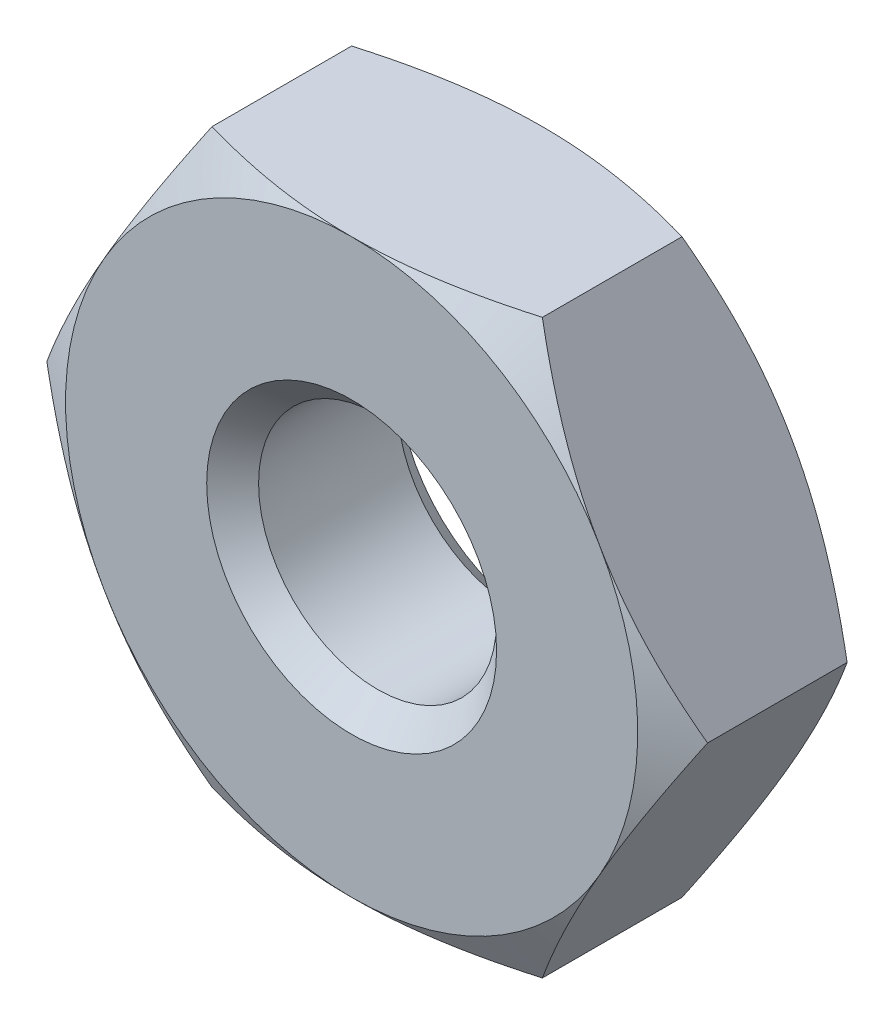
ISO-10303-21;
HEADER;
FILE_DESCRIPTION(('STEP AP214'),'2;1');
FILE_NAME('part.step','',(''),(''),'','','');
FILE_SCHEMA(('AUTOMOTIVE_DESIGN { 1 0 10303 214 1 1 1 1 }'));
ENDSEC;
DATA;
#1=APPLICATION_CONTEXT('core data for automotive mechanical design processes');
#2=APPLICATION_PROTOCOL_DEFINITION('international standard','automotive_design',2000,#1);
#3=PRODUCT_CONTEXT('',#1,'mechanical');
#4=PRODUCT('Part','Part','',(#3));
#5=PRODUCT_RELATED_PRODUCT_CATEGORY('part','',(#4));
#6=PRODUCT_DEFINITION_FORMATION('','',#4);
#7=PRODUCT_DEFINITION_CONTEXT('part definition',#1,'design');
#8=PRODUCT_DEFINITION('design','',#6,#7);
#9=PRODUCT_DEFINITION_SHAPE('','',#8);
#10=(LENGTH_UNIT() NAMED_UNIT(*) SI_UNIT(.MILLI.,.METRE.));
#11=(NAMED_UNIT(*) PLANE_ANGLE_UNIT() SI_UNIT($,.RADIAN.));
#12=(NAMED_UNIT(*) SI_UNIT($,.STERADIAN.) SOLID_ANGLE_UNIT());
#13=UNCERTAINTY_MEASURE_WITH_UNIT(LENGTH_MEASURE(1.E-05),#10,'distance_accuracy_value','');
#14=(GEOMETRIC_REPRESENTATION_CONTEXT(3) GLOBAL_UNCERTAINTY_ASSIGNED_CONTEXT((#13)) GLOBAL_UNIT_ASSIGNED_CONTEXT((#10,
#11,#12)) REPRESENTATION_CONTEXT('',''));
#15=CARTESIAN_POINT('',(0.,0.,0.));
#16=DIRECTION('',(0.,0.,1.));
#17=DIRECTION('',(1.,0.,0.));
#18=AXIS2_PLACEMENT_3D('',#15,#16,#17);
#19=CARTESIAN_POINT('',(0.,4.7625,1.5875));
#20=DIRECTION('',(0.,1.,0.));
#21=DIRECTION('',(0.,0.,1.));
#22=AXIS2_PLACEMENT_3D('',#19,#20,#21);
#23=PLANE('',#22);
#24=CARTESIAN_POINT('',(-7.29242571304484,4.7625,0.691483434039637));
#25=CARTESIAN_POINT('',(-7.08332503258644,4.7625,0.590434434608918));
#26=CARTESIAN_POINT('',(-6.87372996761939,4.7625,0.49038994627171));
#27=CARTESIAN_POINT('',(-6.45328375890254,4.7625,0.292884003041867));
#28=CARTESIAN_POINT('',(-6.24243240531598,4.7625,0.195422995372747));
#29=CARTESIAN_POINT('',(-5.818067307616,4.7625,0.00314459480451547));
#30=CARTESIAN_POINT('',(-5.60454523269943,4.7625,-0.0916544780914601));
#31=CARTESIAN_POINT('',(-5.17574610716181,4.7625,-0.277180770770624));
#32=CARTESIAN_POINT('',(-4.96046914871243,4.7625,-0.367908202800816));
#33=CARTESIAN_POINT('',(-4.5251454275538,4.7625,-0.54528563549685));
#34=CARTESIAN_POINT('',(-4.30507255346546,4.7625,-0.631871903322864));
#35=CARTESIAN_POINT('',(-3.86233085885286,4.7625,-0.79826297392008));
#36=CARTESIAN_POINT('',(-3.6396617526365,4.7625,-0.87806702220485));
#37=CARTESIAN_POINT('',(-3.19183146915336,4.7625,-1.02874956266948));
#38=CARTESIAN_POINT('',(-2.96667674136296,4.7625,-1.09964703053589));
#39=CARTESIAN_POINT('',(-2.51316408606383,4.7625,-1.23021306484863));
#40=CARTESIAN_POINT('',(-2.28480719615868,4.7625,-1.28988518227389));
#41=CARTESIAN_POINT('',(-1.82474524250015,4.7625,-1.39510666427489));
#42=CARTESIAN_POINT('',(-1.59303930440612,4.7625,-1.44065226848496));
#43=CARTESIAN_POINT('',(-1.12680140245445,4.7625,-1.51454273327568));
#44=CARTESIAN_POINT('',(-0.892269436098448,4.7625,-1.5428875786487));
#45=CARTESIAN_POINT('',(-0.54009824342306,4.7625,-1.57068723017757));
#46=CARTESIAN_POINT('',(-0.423010288487476,4.7625,-1.57750225520439));
#47=CARTESIAN_POINT('',(-0.188645495023605,4.7625,-1.58617083260467));
#48=CARTESIAN_POINT('',(-0.0713686589679974,4.7625,-1.58802444940905));
#49=CARTESIAN_POINT('',(0.163123105354889,4.7625,-1.58672040467325));
#50=CARTESIAN_POINT('',(0.280338041752277,4.7625,-1.58356415799784));
#51=CARTESIAN_POINT('',(0.514533140154534,4.7625,-1.57232042625916));
#52=CARTESIAN_POINT('',(0.631513289308026,4.7625,-1.56423267827197));
#53=CARTESIAN_POINT('',(0.915050030184753,4.7625,-1.53882110809835));
#54=CARTESIAN_POINT('',(1.08138937418057,4.7625,-1.5190254688449));
#55=CARTESIAN_POINT('',(1.41276151801412,4.7625,-1.47056600239034));
#56=CARTESIAN_POINT('',(1.57779414061617,4.7625,-1.44190099263948));
#57=CARTESIAN_POINT('',(2.07083902042289,4.7625,-1.34411689937243));
#58=CARTESIAN_POINT('',(2.39654516294855,4.7625,-1.26323434554015));
#59=CARTESIAN_POINT('',(2.88391142522152,4.7625,-1.12373221869611));
#60=CARTESIAN_POINT('',(3.04811363656015,4.7625,-1.07349062409159));
#61=CARTESIAN_POINT('',(3.37480455011008,4.7625,-0.968036135629946));
#62=CARTESIAN_POINT('',(3.53729434901437,4.7625,-0.912826670643465));
#63=CARTESIAN_POINT('',(3.85988055284395,4.7625,-0.798585099627141));
#64=CARTESIAN_POINT('',(4.0199852814054,4.7625,-0.739576259132611));
#65=CARTESIAN_POINT('',(4.33895253974561,4.7625,-0.618095079907987));
#66=CARTESIAN_POINT('',(4.49781453744472,4.7625,-0.555621341349745));
#67=CARTESIAN_POINT('',(4.65610216606022,4.7625,-0.491757089086173));
#68=B_SPLINE_CURVE_WITH_KNOTS('',3,(#24,#25,#26,#27,#28,#29,#30,#31,#32,#33,#34,#35,#36,#37,#38,
#39,#40,#41,#42,#43,#44,#45,#46,#47,#48,#49,#50,#51,#52,#53,#54,#55,#56,#57,#58,#59,#60,#61,#62,
#63,#64,#65,#66,#67),.UNSPECIFIED.,.F.,.F.,(4,2,2,2,2,2,2,2,2,2,2,2,2,2,2,2,2,2,2,2,2,4),(0.,
0.696720165483737,1.39356016205726,2.09438789250382,2.79517904757872,3.50457374312629,
4.21404725210227,4.92198260780581,5.62969364031721,6.33759289852653,7.04549278260687,
7.39726182154396,7.74902629223847,8.10069143675107,8.45237533199633,8.95462912158065,
9.45694990534678,10.4623513294482,10.9774608355396,11.4922174961111,12.0040767603637,
12.5161443452106),.UNSPECIFIED.);
#69=CARTESIAN_POINT('',(-2.7496306570156,4.7625,-1.16213065701559));
#70=VERTEX_POINT('',#69);
#71=CARTESIAN_POINT('',(0.,4.7625,-1.5875));
#72=VERTEX_POINT('',#71);
#73=EDGE_CURVE('E482',#70,#72,#68,.T.);
#74=ORIENTED_EDGE('',*,*,#73,.F.);
#75=DIRECTION('',(0.,0.,-1.));
#76=VECTOR('',#75,1.);
#77=CARTESIAN_POINT('',(-2.7496306570156,4.7625,1.5875));
#78=LINE('',#77,#76);
#79=CARTESIAN_POINT('',(-2.7496306570156,4.7625,1.16213065701559));
#80=VERTEX_POINT('',#79);
#81=EDGE_CURVE('E156',#80,#70,#78,.T.);
#82=ORIENTED_EDGE('',*,*,#81,.F.);
#83=CARTESIAN_POINT('',(-7.29242571304484,4.7625,-0.69148343403963));
#84=CARTESIAN_POINT('',(-7.08332503258644,4.7625,-0.590434434608913));
#85=CARTESIAN_POINT('',(-6.87372996761939,4.7625,-0.490389946271707));
#86=CARTESIAN_POINT('',(-6.45328375890254,4.7625,-0.292884003041865));
#87=CARTESIAN_POINT('',(-6.24243240531598,4.7625,-0.195422995372745));
#88=CARTESIAN_POINT('',(-5.818067307616,4.7625,-0.00314459480451323));
#89=CARTESIAN_POINT('',(-5.60454523269943,4.7625,0.0916544780914618));
#90=CARTESIAN_POINT('',(-5.17574610716181,4.7625,0.277180770770625));
#91=CARTESIAN_POINT('',(-4.96046914871243,4.7625,0.367908202800817));
#92=CARTESIAN_POINT('',(-4.5251454275538,4.7625,0.54528563549685));
#93=CARTESIAN_POINT('',(-4.30507255346547,4.7625,0.631871903322865));
#94=CARTESIAN_POINT('',(-3.86233085885286,4.7625,0.79826297392008));
#95=CARTESIAN_POINT('',(-3.6396617526365,4.7625,0.87806702220485));
#96=CARTESIAN_POINT('',(-3.19183146915336,4.7625,1.02874956266948));
#97=CARTESIAN_POINT('',(-2.96667674136296,4.7625,1.09964703053589));
#98=CARTESIAN_POINT('',(-2.51316408606383,4.7625,1.23021306484863));
#99=CARTESIAN_POINT('',(-2.28480719615868,4.7625,1.28988518227389));
#100=CARTESIAN_POINT('',(-1.82474524250015,4.7625,1.39510666427489));
#101=CARTESIAN_POINT('',(-1.59303930440612,4.7625,1.44065226848496));
#102=CARTESIAN_POINT('',(-1.12680140245445,4.7625,1.51454273327568));
#103=CARTESIAN_POINT('',(-0.892269436098448,4.7625,1.5428875786487));
#104=CARTESIAN_POINT('',(-0.54009824342306,4.7625,1.57068723017757));
#105=CARTESIAN_POINT('',(-0.423010288487477,4.7625,1.57750225520439));
#106=CARTESIAN_POINT('',(-0.188645495023606,4.7625,1.58617083260467));
#107=CARTESIAN_POINT('',(-0.0713686589679986,4.7625,1.58802444940905));
#108=CARTESIAN_POINT('',(0.163123105354887,4.7625,1.58672040467325));
#109=CARTESIAN_POINT('',(0.280338041752275,4.7625,1.58356415799784));
#110=CARTESIAN_POINT('',(0.514533140154532,4.7625,1.57232042625916));
#111=CARTESIAN_POINT('',(0.631513289308023,4.7625,1.56423267827197));
#112=CARTESIAN_POINT('',(0.915050030184751,4.7625,1.53882110809835));
#113=CARTESIAN_POINT('',(1.08138937418057,4.7625,1.5190254688449));
#114=CARTESIAN_POINT('',(1.41276151801412,4.7625,1.47056600239034));
#115=CARTESIAN_POINT('',(1.57779414061617,4.7625,1.44190099263948));
#116=CARTESIAN_POINT('',(2.07083902042289,4.7625,1.34411689937243));
#117=CARTESIAN_POINT('',(2.39654516294855,4.7625,1.26323434554015));
#118=CARTESIAN_POINT('',(2.88391142522152,4.7625,1.12373221869611));
#119=CARTESIAN_POINT('',(3.04811363656016,4.7625,1.07349062409159));
#120=CARTESIAN_POINT('',(3.37480455011009,4.7625,0.968036135629945));
#121=CARTESIAN_POINT('',(3.53729434901437,4.7625,0.912826670643465));
#122=CARTESIAN_POINT('',(3.85988055284396,4.7625,0.79858509962714));
#123=CARTESIAN_POINT('',(4.0199852814054,4.7625,0.739576259132609));
#124=CARTESIAN_POINT('',(4.33895253974562,4.7625,0.618095079907985));
#125=CARTESIAN_POINT('',(4.49781453744473,4.7625,0.555621341349743));
#126=CARTESIAN_POINT('',(4.65610216606023,4.7625,0.491757089086171));
#127=B_SPLINE_CURVE_WITH_KNOTS('',3,(#83,#84,#85,#86,#87,#88,#89,#90,#91,#92,#93,#94,#95,#96,
#97,#98,#99,#100,#101,#102,#103,#104,#105,#106,#107,#108,#109,#110,#111,#112,#113,#114,#115,
#116,#117,#118,#119,#120,#121,#122,#123,#124,#125,#126),.UNSPECIFIED.,.F.,.F.,(4,2,2,2,2,2,2,2,
2,2,2,2,2,2,2,2,2,2,2,2,2,4),(0.,0.696720165483736,1.39356016205726,2.09438789250381,
2.79517904757872,3.50457374312629,4.21404725210227,4.92198260780581,5.6296936403172,
6.33759289852653,7.04549278260686,7.39726182154395,7.74902629223847,8.10069143675107,
8.45237533199633,8.95462912158064,9.45694990534677,10.4623513294482,10.9774608355396,
11.4922174961111,12.0040767603637,12.5161443452106),.UNSPECIFIED.);
#128=CARTESIAN_POINT('',(0.,4.7625,1.5875));
#129=VERTEX_POINT('',#128);
#130=EDGE_CURVE('E308',#80,#129,#127,.T.);
#131=ORIENTED_EDGE('',*,*,#130,.T.);
#132=CARTESIAN_POINT('',(2.74963065701559,4.7625,1.16213065701559));
#133=VERTEX_POINT('',#132);
#134=EDGE_CURVE('E210',#129,#133,#127,.T.);
#135=ORIENTED_EDGE('',*,*,#134,.T.);
#136=DIRECTION('',(0.,0.,-1.));
#137=VECTOR('',#136,1.);
#138=CARTESIAN_POINT('',(2.74963065701559,4.7625,1.5875));
#139=LINE('',#138,#137);
#140=CARTESIAN_POINT('',(2.74963065701559,4.7625,-1.16213065701559));
#141=VERTEX_POINT('',#140);
#142=EDGE_CURVE('E136',#133,#141,#139,.T.);
#143=ORIENTED_EDGE('',*,*,#142,.T.);
#144=EDGE_CURVE('E128',#72,#141,#68,.T.);
#145=ORIENTED_EDGE('',*,*,#144,.F.);
#146=EDGE_LOOP('',(#74,#82,#131,#135,#143,#145));
#147=FACE_BOUND('',#146,.T.);
#148=ADVANCED_FACE('F17',(#147),#23,.T.);
#149=CARTESIAN_POINT('',(-4.12444598552339,2.38125,1.5875));
#150=DIRECTION('',(-0.866025403784439,0.5,0.));
#151=DIRECTION('',(-0.5,-0.866025403784439,0.));
#152=AXIS2_PLACEMENT_3D('',#149,#150,#151);
#153=PLANE('',#152);
#154=CARTESIAN_POINT('',(-5.49937678408503,-0.000200000000000149,-1.16206398824923));
#155=CARTESIAN_POINT('',(-5.37853889601658,0.209097361613877,-1.23184638758605));
#156=CARTESIAN_POINT('',(-5.25666747870888,0.420184848381227,-1.29531673538477));
#157=CARTESIAN_POINT('',(-5.01081433128269,0.846014990924112,-1.40610480393128));
#158=CARTESIAN_POINT('',(-4.88682823299882,1.060765212584,-1.4533833345702));
#159=CARTESIAN_POINT('',(-4.64037371706653,1.48763695593353,-1.52696647463121));
#160=CARTESIAN_POINT('',(-4.51794368116041,1.69969199849541,-1.55376120779827));
#161=CARTESIAN_POINT('',(-4.33386795649885,2.0185205060493,-1.57778887781912));
#162=CARTESIAN_POINT('',(-4.27246738882597,2.12486940887228,-1.58310535899069));
#163=CARTESIAN_POINT('',(-4.1496095068933,2.33766550248998,-1.58825983656829));
#164=CARTESIAN_POINT('',(-4.08815219444489,2.44411269014726,-1.58809800219079));
#165=CARTESIAN_POINT('',(-3.91977561066751,2.73574948805456,-1.58011505017809));
#166=CARTESIAN_POINT('',(-3.81291212955969,2.92084246680697,-1.56670757951211));
#167=CARTESIAN_POINT('',(-3.59989441060936,3.28979997894137,-1.52419213715631));
#168=CARTESIAN_POINT('',(-3.49374092153974,3.47366321541067,-1.4950696317199));
#169=CARTESIAN_POINT('',(-3.28029401006835,3.84336411079777,-1.4222707464131));
#170=CARTESIAN_POINT('',(-3.17302752682367,4.02915510972679,-1.37828588695335));
#171=CARTESIAN_POINT('',(-2.96009430473234,4.39796626900832,-1.27845772006117));
#172=CARTESIAN_POINT('',(-2.85442483842812,4.58099115345591,-1.22263786532194));
#173=CARTESIAN_POINT('',(-2.74951518696175,4.7627,-1.16206398824923));
#174=B_SPLINE_CURVE_WITH_KNOTS('',3,(#154,#155,#156,#157,#158,#159,#160,#161,#162,#163,#164,
#165,#166,#167,#168,#169,#170,#171,#172,#173),.UNSPECIFIED.,.F.,.F.,(4,2,2,2,2,2,2,2,2,4),(0.,
0.754910190012918,1.51163483480638,2.24963134670895,2.61827336240839,2.9869039913527,
3.6286742319225,4.27103902109237,4.92765153591997,5.58297484368455),.UNSPECIFIED.);
#175=CARTESIAN_POINT('',(-5.49926131403119,0.,-1.16213065701559));
#176=VERTEX_POINT('',#175);
#177=CARTESIAN_POINT('',(-4.12444598552339,2.38125,-1.5875));
#178=VERTEX_POINT('',#177);
#179=EDGE_CURVE('E255',#176,#178,#174,.T.);
#180=ORIENTED_EDGE('',*,*,#179,.F.);
#181=DIRECTION('',(0.,0.,-1.));
#182=VECTOR('',#181,1.);
#183=CARTESIAN_POINT('',(-5.49926131403119,0.,1.5875));
#184=LINE('',#183,#182);
#185=CARTESIAN_POINT('',(-5.49926131403119,0.,1.16213065701559));
#186=VERTEX_POINT('',#185);
#187=EDGE_CURVE('E152',#186,#176,#184,.T.);
#188=ORIENTED_EDGE('',*,*,#187,.F.);
#189=CARTESIAN_POINT('',(-5.49937678408503,-0.000200000000000149,1.16206398824923));
#190=CARTESIAN_POINT('',(-5.37853889601658,0.209097361613877,1.23184638758605));
#191=CARTESIAN_POINT('',(-5.25666747870888,0.420184848381226,1.29531673538478));
#192=CARTESIAN_POINT('',(-5.01081433128269,0.846014990924112,1.40610480393128));
#193=CARTESIAN_POINT('',(-4.88682823299882,1.060765212584,1.4533833345702));
#194=CARTESIAN_POINT('',(-4.64037371706653,1.48763695593353,1.52696647463121));
#195=CARTESIAN_POINT('',(-4.51794368116041,1.69969199849541,1.55376120779827));
#196=CARTESIAN_POINT('',(-4.33386795649885,2.0185205060493,1.57778887781912));
#197=CARTESIAN_POINT('',(-4.27246738882597,2.12486940887228,1.58310535899069));
#198=CARTESIAN_POINT('',(-4.1496095068933,2.33766550248998,1.58825983656829));
#199=CARTESIAN_POINT('',(-4.08815219444489,2.44411269014726,1.58809800219079));
#200=CARTESIAN_POINT('',(-3.91977561066751,2.73574948805456,1.58011505017809));
#201=CARTESIAN_POINT('',(-3.81291212955969,2.92084246680697,1.56670757951211));
#202=CARTESIAN_POINT('',(-3.59989441060936,3.28979997894137,1.52419213715631));
#203=CARTESIAN_POINT('',(-3.49374092153974,3.47366321541067,1.4950696317199));
#204=CARTESIAN_POINT('',(-3.28029401006835,3.84336411079777,1.4222707464131));
#205=CARTESIAN_POINT('',(-3.17302752682367,4.02915510972679,1.37828588695335));
#206=CARTESIAN_POINT('',(-2.96009430473234,4.39796626900832,1.27845772006117));
#207=CARTESIAN_POINT('',(-2.85442483842812,4.58099115345591,1.22263786532194));
#208=CARTESIAN_POINT('',(-2.74951518696175,4.7627,1.16206398824923));
#209=B_SPLINE_CURVE_WITH_KNOTS('',3,(#189,#190,#191,#192,#193,#194,#195,#196,#197,#198,#199,
#200,#201,#202,#203,#204,#205,#206,#207,#208),.UNSPECIFIED.,.F.,.F.,(4,2,2,2,2,2,2,2,2,4),(0.,
0.754910190012918,1.51163483480638,2.24963134670895,2.61827336240839,2.9869039913527,
3.6286742319225,4.27103902109237,4.92765153591997,5.58297484368455),.UNSPECIFIED.);
#210=CARTESIAN_POINT('',(-4.12444598552339,2.38125,1.5875));
#211=VERTEX_POINT('',#210);
#212=EDGE_CURVE('E232',#186,#211,#209,.T.);
#213=ORIENTED_EDGE('',*,*,#212,.T.);
#214=EDGE_CURVE('E224',#211,#80,#209,.T.);
#215=ORIENTED_EDGE('',*,*,#214,.T.);
#216=ORIENTED_EDGE('',*,*,#81,.T.);
#217=EDGE_CURVE('E248',#178,#70,#174,.T.);
#218=ORIENTED_EDGE('',*,*,#217,.F.);
#219=EDGE_LOOP('',(#180,#188,#213,#215,#216,#218));
#220=FACE_BOUND('',#219,.T.);
#221=ADVANCED_FACE('F239',(#220),#153,.T.);
#222=CARTESIAN_POINT('',(-4.12444598552339,-2.38125,1.5875));
#223=DIRECTION('',(-0.866025403784438,-0.5,0.));
#224=DIRECTION('',(0.5,-0.866025403784438,0.));
#225=AXIS2_PLACEMENT_3D('',#222,#223,#224);
#226=PLANE('',#225);
#227=CARTESIAN_POINT('',(-2.74951518696175,-4.7627,-1.16206398824923));
#228=CARTESIAN_POINT('',(-2.8703530750302,-4.55340263838612,-1.23184638758605));
#229=CARTESIAN_POINT('',(-2.9922244923379,-4.34231515161877,-1.29531673538478));
#230=CARTESIAN_POINT('',(-3.23807763976409,-3.91648500907589,-1.40610480393128));
#231=CARTESIAN_POINT('',(-3.36206373804796,-3.701734787416,-1.4533833345702));
#232=CARTESIAN_POINT('',(-3.60851825398025,-3.27486304406647,-1.52696647463121));
#233=CARTESIAN_POINT('',(-3.73094828988637,-3.06280800150459,-1.55376120779827));
#234=CARTESIAN_POINT('',(-3.91502401454793,-2.7439794939507,-1.57778887781912));
#235=CARTESIAN_POINT('',(-3.97642458222081,-2.63763059112772,-1.58310535899069));
#236=CARTESIAN_POINT('',(-4.09928246415348,-2.42483449751002,-1.58825983656829));
#237=CARTESIAN_POINT('',(-4.1607397766019,-2.31838730985274,-1.58809800219079));
#238=CARTESIAN_POINT('',(-4.32911636037927,-2.02675051194544,-1.58011505017809));
#239=CARTESIAN_POINT('',(-4.43597984148709,-1.84165753319303,-1.56670757951211));
#240=CARTESIAN_POINT('',(-4.64899756043742,-1.47270002105863,-1.52419213715631));
#241=CARTESIAN_POINT('',(-4.75515104950704,-1.28883678458933,-1.4950696317199));
#242=CARTESIAN_POINT('',(-4.96859796097843,-0.919135889202231,-1.4222707464131));
#243=CARTESIAN_POINT('',(-5.07586444422311,-0.733344890273211,-1.37828588695334));
#244=CARTESIAN_POINT('',(-5.28879766631444,-0.364533730991676,-1.27845772006117));
#245=CARTESIAN_POINT('',(-5.39446713261866,-0.18150884654409,-1.22263786532194));
#246=CARTESIAN_POINT('',(-5.49937678408503,0.000199999999999961,-1.16206398824923));
#247=B_SPLINE_CURVE_WITH_KNOTS('',3,(#227,#228,#229,#230,#231,#232,#233,#234,#235,#236,#237,
#238,#239,#240,#241,#242,#243,#244,#245,#246),.UNSPECIFIED.,.F.,.F.,(4,2,2,2,2,2,2,2,2,4),(0.,
0.754910190012918,1.51163483480638,2.24963134670895,2.61827336240839,2.9869039913527,
3.6286742319225,4.27103902109237,4.92765153591997,5.58297484368456),.UNSPECIFIED.);
#248=CARTESIAN_POINT('',(-2.7496306570156,-4.7625,-1.16213065701559));
#249=VERTEX_POINT('',#248);
#250=CARTESIAN_POINT('',(-4.12444598552339,-2.38125,-1.5875));
#251=VERTEX_POINT('',#250);
#252=EDGE_CURVE('E268',#249,#251,#247,.T.);
#253=ORIENTED_EDGE('',*,*,#252,.F.);
#254=DIRECTION('',(0.,0.,-1.));
#255=VECTOR('',#254,1.);
#256=CARTESIAN_POINT('',(-2.74963065701559,-4.7625,1.5875));
#257=LINE('',#256,#255);
#258=CARTESIAN_POINT('',(-2.7496306570156,-4.7625,1.16213065701559));
#259=VERTEX_POINT('',#258);
#260=EDGE_CURVE('E141',#259,#249,#257,.T.);
#261=ORIENTED_EDGE('',*,*,#260,.F.);
#262=CARTESIAN_POINT('',(-2.74951518696175,-4.7627,1.16206398824923));
#263=CARTESIAN_POINT('',(-2.8703530750302,-4.55340263838612,1.23184638758605));
#264=CARTESIAN_POINT('',(-2.9922244923379,-4.34231515161877,1.29531673538478));
#265=CARTESIAN_POINT('',(-3.23807763976409,-3.91648500907589,1.40610480393128));
#266=CARTESIAN_POINT('',(-3.36206373804796,-3.701734787416,1.4533833345702));
#267=CARTESIAN_POINT('',(-3.60851825398025,-3.27486304406647,1.52696647463121));
#268=CARTESIAN_POINT('',(-3.73094828988637,-3.06280800150459,1.55376120779827));
#269=CARTESIAN_POINT('',(-3.91502401454793,-2.7439794939507,1.57778887781912));
#270=CARTESIAN_POINT('',(-3.97642458222081,-2.63763059112772,1.58310535899069));
#271=CARTESIAN_POINT('',(-4.09928246415348,-2.42483449751002,1.58825983656829));
#272=CARTESIAN_POINT('',(-4.1607397766019,-2.31838730985274,1.58809800219079));
#273=CARTESIAN_POINT('',(-4.32911636037927,-2.02675051194544,1.58011505017809));
#274=CARTESIAN_POINT('',(-4.43597984148709,-1.84165753319303,1.56670757951211));
#275=CARTESIAN_POINT('',(-4.64899756043742,-1.47270002105863,1.52419213715631));
#276=CARTESIAN_POINT('',(-4.75515104950704,-1.28883678458933,1.4950696317199));
#277=CARTESIAN_POINT('',(-4.96859796097843,-0.919135889202232,1.4222707464131));
#278=CARTESIAN_POINT('',(-5.07586444422311,-0.733344890273212,1.37828588695335));
#279=CARTESIAN_POINT('',(-5.28879766631444,-0.364533730991678,1.27845772006117));
#280=CARTESIAN_POINT('',(-5.39446713261866,-0.181508846544092,1.22263786532194));
#281=CARTESIAN_POINT('',(-5.49937678408503,0.000199999999998806,1.16206398824923));
#282=B_SPLINE_CURVE_WITH_KNOTS('',3,(#262,#263,#264,#265,#266,#267,#268,#269,#270,#271,#272,
#273,#274,#275,#276,#277,#278,#279,#280,#281),.UNSPECIFIED.,.F.,.F.,(4,2,2,2,2,2,2,2,2,4),(0.,
0.754910190012917,1.51163483480638,2.24963134670895,2.61827336240839,2.9869039913527,
3.6286742319225,4.27103902109237,4.92765153591997,5.58297484368455),.UNSPECIFIED.);
#283=CARTESIAN_POINT('',(-4.12444598552339,-2.38125,1.5875));
#284=VERTEX_POINT('',#283);
#285=EDGE_CURVE('E145',#259,#284,#282,.T.);
#286=ORIENTED_EDGE('',*,*,#285,.T.);
#287=EDGE_CURVE('E233',#284,#186,#282,.T.);
#288=ORIENTED_EDGE('',*,*,#287,.T.);
#289=ORIENTED_EDGE('',*,*,#187,.T.);
#290=EDGE_CURVE('E262',#251,#176,#247,.T.);
#291=ORIENTED_EDGE('',*,*,#290,.F.);
#292=EDGE_LOOP('',(#253,#261,#286,#288,#289,#291));
#293=FACE_BOUND('',#292,.T.);
#294=ADVANCED_FACE('F242',(#293),#226,.T.);
#295=CARTESIAN_POINT('',(0.,-4.7625,1.5875));
#296=DIRECTION('',(0.,-1.,0.));
#297=DIRECTION('',(0.,0.,-1.));
#298=AXIS2_PLACEMENT_3D('',#295,#296,#297);
#299=PLANE('',#298);
#300=CARTESIAN_POINT('',(-7.29242571304483,-4.7625,0.691483434039635));
#301=CARTESIAN_POINT('',(-7.08332503258643,-4.7625,0.590434434608914));
#302=CARTESIAN_POINT('',(-6.87372996761938,-4.7625,0.490389946271706));
#303=CARTESIAN_POINT('',(-6.45328375890254,-4.7625,0.292884003041863));
#304=CARTESIAN_POINT('',(-6.24243240531597,-4.7625,0.195422995372744));
#305=CARTESIAN_POINT('',(-5.81806730761599,-4.7625,0.00314459480451335));
#306=CARTESIAN_POINT('',(-5.60454523269943,-4.7625,-0.0916544780914621));
#307=CARTESIAN_POINT('',(-5.1757461071618,-4.7625,-0.277180770770626));
#308=CARTESIAN_POINT('',(-4.96046914871242,-4.7625,-0.367908202800818));
#309=CARTESIAN_POINT('',(-4.5251454275538,-4.7625,-0.545285635496851));
#310=CARTESIAN_POINT('',(-4.30507255346546,-4.7625,-0.631871903322865));
#311=CARTESIAN_POINT('',(-3.86233085885286,-4.7625,-0.798262973920081));
#312=CARTESIAN_POINT('',(-3.6396617526365,-4.7625,-0.878067022204851));
#313=CARTESIAN_POINT('',(-3.19183146915336,-4.7625,-1.02874956266948));
#314=CARTESIAN_POINT('',(-2.96667674136295,-4.7625,-1.09964703053589));
#315=CARTESIAN_POINT('',(-2.51316408606383,-4.7625,-1.23021306484863));
#316=CARTESIAN_POINT('',(-2.28480719615868,-4.7625,-1.2898851822739));
#317=CARTESIAN_POINT('',(-1.82474524250015,-4.7625,-1.39510666427489));
#318=CARTESIAN_POINT('',(-1.59303930440612,-4.7625,-1.44065226848496));
#319=CARTESIAN_POINT('',(-1.12680140245445,-4.7625,-1.51454273327567));
#320=CARTESIAN_POINT('',(-0.892269436098447,-4.7625,-1.5428875786487));
#321=CARTESIAN_POINT('',(-0.540098243423059,-4.7625,-1.57068723017757));
#322=CARTESIAN_POINT('',(-0.423010288487475,-4.7625,-1.57750225520439));
#323=CARTESIAN_POINT('',(-0.188645495023604,-4.7625,-1.58617083260467));
#324=CARTESIAN_POINT('',(-0.0713686589679967,-4.7625,-1.58802444940905));
#325=CARTESIAN_POINT('',(0.16312310535489,-4.7625,-1.58672040467325));
#326=CARTESIAN_POINT('',(0.280338041752279,-4.7625,-1.58356415799784));
#327=CARTESIAN_POINT('',(0.514533140154536,-4.7625,-1.57232042625916));
#328=CARTESIAN_POINT('',(0.631513289308028,-4.7625,-1.56423267827197));
#329=CARTESIAN_POINT('',(0.915050030184756,-4.7625,-1.53882110809835));
#330=CARTESIAN_POINT('',(1.08138937418058,-4.7625,-1.51902546884489));
#331=CARTESIAN_POINT('',(1.41276151801412,-4.7625,-1.47056600239034));
#332=CARTESIAN_POINT('',(1.57779414061617,-4.7625,-1.44190099263948));
#333=CARTESIAN_POINT('',(2.07083902042289,-4.7625,-1.34411689937243));
#334=CARTESIAN_POINT('',(2.39654516294855,-4.7625,-1.26323434554015));
#335=CARTESIAN_POINT('',(2.88391142522152,-4.7625,-1.1237322186961));
#336=CARTESIAN_POINT('',(3.04811363656016,-4.7625,-1.07349062409159));
#337=CARTESIAN_POINT('',(3.37480455011009,-4.7625,-0.968036135629944));
#338=CARTESIAN_POINT('',(3.53729434901437,-4.7625,-0.912826670643465));
#339=CARTESIAN_POINT('',(3.85988055284395,-4.7625,-0.798585099627141));
#340=CARTESIAN_POINT('',(4.0199852814054,-4.7625,-0.73957625913261));
#341=CARTESIAN_POINT('',(4.33895253974562,-4.7625,-0.618095079907986));
#342=CARTESIAN_POINT('',(4.49781453744472,-4.7625,-0.555621341349744));
#343=CARTESIAN_POINT('',(4.65610216606022,-4.7625,-0.491757089086171));
#344=B_SPLINE_CURVE_WITH_KNOTS('',3,(#300,#301,#302,#303,#304,#305,#306,#307,#308,#309,#310,
#311,#312,#313,#314,#315,#316,#317,#318,#319,#320,#321,#322,#323,#324,#325,#326,#327,#328,#329,
#330,#331,#332,#333,#334,#335,#336,#337,#338,#339,#340,#341,#342,#343),.UNSPECIFIED.,.F.,.F.,(4,
2,2,2,2,2,2,2,2,2,2,2,2,2,2,2,2,2,2,2,2,4),(0.,0.696720165483734,1.39356016205725,
2.09438789250381,2.79517904757872,3.50457374312628,4.21404725210226,4.9219826078058,
5.6296936403172,6.33759289852652,7.04549278260686,7.39726182154395,7.74902629223846,
8.10069143675107,8.45237533199633,8.95462912158064,9.45694990534677,10.4623513294482,
10.9774608355396,11.4922174961111,12.0040767603637,12.5161443452105),.UNSPECIFIED.);
#345=CARTESIAN_POINT('',(2.74963065701559,-4.7625,-1.16213065701559));
#346=VERTEX_POINT('',#345);
#347=CARTESIAN_POINT('',(0.,-4.7625,-1.5875));
#348=VERTEX_POINT('',#347);
#349=EDGE_CURVE('E256',#346,#348,#344,.F.);
#350=ORIENTED_EDGE('',*,*,#349,.F.);
#351=DIRECTION('',(0.,0.,-1.));
#352=VECTOR('',#351,1.);
#353=CARTESIAN_POINT('',(2.7496306570156,-4.7625,1.5875));
#354=LINE('',#353,#352);
#355=CARTESIAN_POINT('',(2.74963065701559,-4.7625,1.16213065701559));
#356=VERTEX_POINT('',#355);
#357=EDGE_CURVE('E135',#356,#346,#354,.T.);
#358=ORIENTED_EDGE('',*,*,#357,.F.);
#359=CARTESIAN_POINT('',(-7.29242571304483,-4.7625,-0.691483434039629));
#360=CARTESIAN_POINT('',(-7.08332503258643,-4.7625,-0.59043443460891));
#361=CARTESIAN_POINT('',(-6.87372996761938,-4.7625,-0.490389946271703));
#362=CARTESIAN_POINT('',(-6.45328375890254,-4.7625,-0.292884003041861));
#363=CARTESIAN_POINT('',(-6.24243240531597,-4.7625,-0.195422995372742));
#364=CARTESIAN_POINT('',(-5.81806730761599,-4.7625,-0.00314459480451045));
#365=CARTESIAN_POINT('',(-5.60454523269943,-4.7625,0.0916544780914648));
#366=CARTESIAN_POINT('',(-5.1757461071618,-4.7625,0.277180770770628));
#367=CARTESIAN_POINT('',(-4.96046914871242,-4.7625,0.36790820280082));
#368=CARTESIAN_POINT('',(-4.5251454275538,-4.7625,0.545285635496852));
#369=CARTESIAN_POINT('',(-4.30507255346546,-4.7625,0.631871903322867));
#370=CARTESIAN_POINT('',(-3.86233085885285,-4.7625,0.798262973920082));
#371=CARTESIAN_POINT('',(-3.6396617526365,-4.7625,0.878067022204852));
#372=CARTESIAN_POINT('',(-3.19183146915336,-4.7625,1.02874956266948));
#373=CARTESIAN_POINT('',(-2.96667674136295,-4.7625,1.09964703053589));
#374=CARTESIAN_POINT('',(-2.51316408606383,-4.7625,1.23021306484864));
#375=CARTESIAN_POINT('',(-2.28480719615868,-4.7625,1.2898851822739));
#376=CARTESIAN_POINT('',(-1.82474524250015,-4.7625,1.39510666427489));
#377=CARTESIAN_POINT('',(-1.59303930440612,-4.7625,1.44065226848496));
#378=CARTESIAN_POINT('',(-1.12680140245445,-4.7625,1.51454273327567));
#379=CARTESIAN_POINT('',(-0.892269436098448,-4.7625,1.5428875786487));
#380=CARTESIAN_POINT('',(-0.540098243423059,-4.7625,1.57068723017757));
#381=CARTESIAN_POINT('',(-0.423010288487475,-4.7625,1.57750225520439));
#382=CARTESIAN_POINT('',(-0.188645495023604,-4.7625,1.58617083260467));
#383=CARTESIAN_POINT('',(-0.0713686589679967,-4.7625,1.58802444940905));
#384=CARTESIAN_POINT('',(0.16312310535489,-4.7625,1.58672040467325));
#385=CARTESIAN_POINT('',(0.280338041752278,-4.7625,1.58356415799784));
#386=CARTESIAN_POINT('',(0.514533140154535,-4.7625,1.57232042625916));
#387=CARTESIAN_POINT('',(0.631513289308026,-4.7625,1.56423267827197));
#388=CARTESIAN_POINT('',(0.915050030184755,-4.7625,1.53882110809835));
#389=CARTESIAN_POINT('',(1.08138937418058,-4.7625,1.51902546884489));
#390=CARTESIAN_POINT('',(1.41276151801413,-4.7625,1.47056600239034));
#391=CARTESIAN_POINT('',(1.57779414061617,-4.7625,1.44190099263948));
#392=CARTESIAN_POINT('',(2.0708390204229,-4.7625,1.34411689937243));
#393=CARTESIAN_POINT('',(2.39654516294856,-4.7625,1.26323434554015));
#394=CARTESIAN_POINT('',(2.88391142522153,-4.7625,1.1237322186961));
#395=CARTESIAN_POINT('',(3.04811363656017,-4.7625,1.07349062409159));
#396=CARTESIAN_POINT('',(3.3748045501101,-4.7625,0.968036135629942));
#397=CARTESIAN_POINT('',(3.53729434901438,-4.7625,0.912826670643461));
#398=CARTESIAN_POINT('',(3.85988055284397,-4.7625,0.798585099627136));
#399=CARTESIAN_POINT('',(4.01998528140541,-4.7625,0.739576259132605));
#400=CARTESIAN_POINT('',(4.33895253974563,-4.7625,0.618095079907981));
#401=CARTESIAN_POINT('',(4.49781453744474,-4.7625,0.55562134134974));
#402=CARTESIAN_POINT('',(4.65610216606024,-4.7625,0.491757089086169));
#403=B_SPLINE_CURVE_WITH_KNOTS('',3,(#359,#360,#361,#362,#363,#364,#365,#366,#367,#368,#369,
#370,#371,#372,#373,#374,#375,#376,#377,#378,#379,#380,#381,#382,#383,#384,#385,#386,#387,#388,
#389,#390,#391,#392,#393,#394,#395,#396,#397,#398,#399,#400,#401,#402),.UNSPECIFIED.,.F.,.F.,(4,
2,2,2,2,2,2,2,2,2,2,2,2,2,2,2,2,2,2,2,2,4),(0.,0.696720165483734,1.39356016205725,
2.09438789250381,2.79517904757872,3.50457374312628,4.21404725210226,4.9219826078058,
5.62969364031719,6.33759289852652,7.04549278260686,7.39726182154394,7.74902629223846,
8.10069143675106,8.45237533199632,8.95462912158064,9.45694990534677,10.4623513294482,
10.9774608355396,11.4922174961111,12.0040767603637,12.5161443452106),.UNSPECIFIED.);
#404=CARTESIAN_POINT('',(0.,-4.7625,1.5875));
#405=VERTEX_POINT('',#404);
#406=EDGE_CURVE('E217',#356,#405,#403,.F.);
#407=ORIENTED_EDGE('',*,*,#406,.T.);
#408=EDGE_CURVE('E313',#405,#259,#403,.F.);
#409=ORIENTED_EDGE('',*,*,#408,.T.);
#410=ORIENTED_EDGE('',*,*,#260,.T.);
#411=EDGE_CURVE('E269',#348,#249,#344,.F.);
#412=ORIENTED_EDGE('',*,*,#411,.F.);
#413=EDGE_LOOP('',(#350,#358,#407,#409,#410,#412));
#414=FACE_BOUND('',#413,.T.);
#415=ADVANCED_FACE('F355',(#414),#299,.T.);
#416=CARTESIAN_POINT('',(4.12444598552339,-2.38125,1.5875));
#417=DIRECTION('',(0.866025403784439,-0.5,0.));
#418=DIRECTION('',(0.5,0.866025403784439,0.));
#419=AXIS2_PLACEMENT_3D('',#416,#417,#418);
#420=PLANE('',#419);
#421=CARTESIAN_POINT('',(5.49937678408503,0.000200000000002317,-1.16206398824923));
#422=CARTESIAN_POINT('',(5.37853889601658,-0.209097361613875,-1.23184638758605));
#423=CARTESIAN_POINT('',(5.25666747870888,-0.420184848381225,-1.29531673538477));
#424=CARTESIAN_POINT('',(5.01081433128269,-0.846014990924111,-1.40610480393128));
#425=CARTESIAN_POINT('',(4.88682823299882,-1.060765212584,-1.4533833345702));
#426=CARTESIAN_POINT('',(4.64037371706653,-1.48763695593353,-1.52696647463121));
#427=CARTESIAN_POINT('',(4.51794368116041,-1.69969199849541,-1.55376120779827));
#428=CARTESIAN_POINT('',(4.33386795649885,-2.0185205060493,-1.57778887781912));
#429=CARTESIAN_POINT('',(4.27246738882597,-2.12486940887228,-1.58310535899069));
#430=CARTESIAN_POINT('',(4.1496095068933,-2.33766550248998,-1.58825983656829));
#431=CARTESIAN_POINT('',(4.08815219444489,-2.44411269014726,-1.58809800219079));
#432=CARTESIAN_POINT('',(3.91977561066751,-2.73574948805456,-1.58011505017809));
#433=CARTESIAN_POINT('',(3.81291212955969,-2.92084246680697,-1.56670757951211));
#434=CARTESIAN_POINT('',(3.59989441060936,-3.28979997894137,-1.52419213715631));
#435=CARTESIAN_POINT('',(3.49374092153974,-3.47366321541067,-1.4950696317199));
#436=CARTESIAN_POINT('',(3.28029401006835,-3.84336411079777,-1.4222707464131));
#437=CARTESIAN_POINT('',(3.17302752682367,-4.02915510972679,-1.37828588695335));
#438=CARTESIAN_POINT('',(2.96009430473234,-4.39796626900832,-1.27845772006117));
#439=CARTESIAN_POINT('',(2.85442483842812,-4.58099115345591,-1.22263786532194));
#440=CARTESIAN_POINT('',(2.74951518696175,-4.7627,-1.16206398824923));
#441=B_SPLINE_CURVE_WITH_KNOTS('',3,(#421,#422,#423,#424,#425,#426,#427,#428,#429,#430,#431,
#432,#433,#434,#435,#436,#437,#438,#439,#440),.UNSPECIFIED.,.F.,.F.,(4,2,2,2,2,2,2,2,2,4),(0.,
0.754910190012918,1.51163483480638,2.24963134670895,2.6182733624084,2.9869039913527,
3.6286742319225,4.27103902109237,4.92765153591997,5.58297484368456),.UNSPECIFIED.);
#442=CARTESIAN_POINT('',(5.49926131403119,0.,-1.16213065701559));
#443=VERTEX_POINT('',#442);
#444=CARTESIAN_POINT('',(4.12444598552339,-2.38125,-1.5875));
#445=VERTEX_POINT('',#444);
#446=EDGE_CURVE('E112',#443,#445,#441,.T.);
#447=ORIENTED_EDGE('',*,*,#446,.F.);
#448=DIRECTION('',(0.,0.,-1.));
#449=VECTOR('',#448,1.);
#450=CARTESIAN_POINT('',(5.49926131403119,0.,1.5875));
#451=LINE('',#450,#449);
#452=CARTESIAN_POINT('',(5.49926131403119,0.,1.16213065701559));
#453=VERTEX_POINT('',#452);
#454=EDGE_CURVE('E124',#453,#443,#451,.T.);
#455=ORIENTED_EDGE('',*,*,#454,.F.);
#456=CARTESIAN_POINT('',(5.49937678408503,0.000200000000002317,1.16206398824923));
#457=CARTESIAN_POINT('',(5.37853889601658,-0.209097361613875,1.23184638758605));
#458=CARTESIAN_POINT('',(5.25666747870888,-0.420184848381225,1.29531673538477));
#459=CARTESIAN_POINT('',(5.01081433128269,-0.846014990924111,1.40610480393128));
#460=CARTESIAN_POINT('',(4.88682823299882,-1.060765212584,1.4533833345702));
#461=CARTESIAN_POINT('',(4.64037371706653,-1.48763695593353,1.52696647463121));
#462=CARTESIAN_POINT('',(4.51794368116041,-1.69969199849541,1.55376120779827));
#463=CARTESIAN_POINT('',(4.33386795649885,-2.0185205060493,1.57778887781912));
#464=CARTESIAN_POINT('',(4.27246738882597,-2.12486940887228,1.58310535899069));
#465=CARTESIAN_POINT('',(4.1496095068933,-2.33766550248998,1.58825983656829));
#466=CARTESIAN_POINT('',(4.08815219444489,-2.44411269014726,1.58809800219079));
#467=CARTESIAN_POINT('',(3.91977561066751,-2.73574948805456,1.58011505017809));
#468=CARTESIAN_POINT('',(3.81291212955969,-2.92084246680697,1.56670757951211));
#469=CARTESIAN_POINT('',(3.59989441060936,-3.28979997894137,1.52419213715631));
#470=CARTESIAN_POINT('',(3.49374092153974,-3.47366321541067,1.4950696317199));
#471=CARTESIAN_POINT('',(3.28029401006835,-3.84336411079777,1.4222707464131));
#472=CARTESIAN_POINT('',(3.17302752682367,-4.02915510972679,1.37828588695335));
#473=CARTESIAN_POINT('',(2.96009430473234,-4.39796626900832,1.27845772006117));
#474=CARTESIAN_POINT('',(2.85442483842812,-4.58099115345591,1.22263786532194));
#475=CARTESIAN_POINT('',(2.74951518696175,-4.7627,1.16206398824923));
#476=B_SPLINE_CURVE_WITH_KNOTS('',3,(#456,#457,#458,#459,#460,#461,#462,#463,#464,#465,#466,
#467,#468,#469,#470,#471,#472,#473,#474,#475),.UNSPECIFIED.,.F.,.F.,(4,2,2,2,2,2,2,2,2,4),(0.,
0.754910190012918,1.51163483480638,2.24963134670895,2.6182733624084,2.9869039913527,
3.6286742319225,4.27103902109237,4.92765153591997,5.58297484368456),.UNSPECIFIED.);
#477=CARTESIAN_POINT('',(4.12444598552339,-2.38125,1.5875));
#478=VERTEX_POINT('',#477);
#479=EDGE_CURVE('E202',#453,#478,#476,.T.);
#480=ORIENTED_EDGE('',*,*,#479,.T.);
#481=EDGE_CURVE('E280',#478,#356,#476,.T.);
#482=ORIENTED_EDGE('',*,*,#481,.T.);
#483=ORIENTED_EDGE('',*,*,#357,.T.);
#484=EDGE_CURVE('E126',#445,#346,#441,.T.);
#485=ORIENTED_EDGE('',*,*,#484,.F.);
#486=EDGE_LOOP('',(#447,#455,#480,#482,#483,#485));
#487=FACE_BOUND('',#486,.T.);
#488=ADVANCED_FACE('F122',(#487),#420,.T.);
#489=CARTESIAN_POINT('',(4.12444598552339,2.38125,1.5875));
#490=DIRECTION('',(0.866025403784438,0.5,0.));
#491=DIRECTION('',(-0.5,0.866025403784438,0.));
#492=AXIS2_PLACEMENT_3D('',#489,#490,#491);
#493=PLANE('',#492);
#494=CARTESIAN_POINT('',(2.74951518696175,4.7627,-1.16206398824923));
#495=CARTESIAN_POINT('',(2.8703530750302,4.55340263838612,-1.23184638758605));
#496=CARTESIAN_POINT('',(2.9922244923379,4.34231515161877,-1.29531673538477));
#497=CARTESIAN_POINT('',(3.23807763976409,3.91648500907589,-1.40610480393128));
#498=CARTESIAN_POINT('',(3.36206373804796,3.701734787416,-1.4533833345702));
#499=CARTESIAN_POINT('',(3.60851825398025,3.27486304406647,-1.52696647463121));
#500=CARTESIAN_POINT('',(3.73094828988637,3.06280800150459,-1.55376120779827));
#501=CARTESIAN_POINT('',(3.91502401454793,2.74397949395071,-1.57778887781912));
#502=CARTESIAN_POINT('',(3.9764245822208,2.63763059112772,-1.58310535899069));
#503=CARTESIAN_POINT('',(4.09928246415348,2.42483449751003,-1.58825983656829));
#504=CARTESIAN_POINT('',(4.1607397766019,2.31838730985274,-1.58809800219079));
#505=CARTESIAN_POINT('',(4.32911636037927,2.02675051194545,-1.58011505017809));
#506=CARTESIAN_POINT('',(4.43597984148709,1.84165753319304,-1.56670757951211));
#507=CARTESIAN_POINT('',(4.64899756043742,1.47270002105863,-1.52419213715631));
#508=CARTESIAN_POINT('',(4.75515104950704,1.28883678458933,-1.4950696317199));
#509=CARTESIAN_POINT('',(4.96859796097843,0.919135889202234,-1.4222707464131));
#510=CARTESIAN_POINT('',(5.07586444422311,0.733344890273213,-1.37828588695335));
#511=CARTESIAN_POINT('',(5.28879766631444,0.364533730991679,-1.27845772006117));
#512=CARTESIAN_POINT('',(5.39446713261866,0.181508846544092,-1.22263786532194));
#513=CARTESIAN_POINT('',(5.49937678408503,-0.00019999999999719,-1.16206398824923));
#514=B_SPLINE_CURVE_WITH_KNOTS('',3,(#494,#495,#496,#497,#498,#499,#500,#501,#502,#503,#504,
#505,#506,#507,#508,#509,#510,#511,#512,#513),.UNSPECIFIED.,.F.,.F.,(4,2,2,2,2,2,2,2,2,4),(0.,
0.754910190012916,1.51163483480638,2.24963134670895,2.61827336240839,2.9869039913527,
3.6286742319225,4.27103902109237,4.92765153591997,5.58297484368455),.UNSPECIFIED.);
#515=CARTESIAN_POINT('',(4.12444598552339,2.38125,-1.5875));
#516=VERTEX_POINT('',#515);
#517=EDGE_CURVE('E11',#141,#516,#514,.T.);
#518=ORIENTED_EDGE('',*,*,#517,.F.);
#519=ORIENTED_EDGE('',*,*,#142,.F.);
#520=CARTESIAN_POINT('',(2.74951518696175,4.7627,1.16206398824923));
#521=CARTESIAN_POINT('',(2.8703530750302,4.55340263838612,1.23184638758605));
#522=CARTESIAN_POINT('',(2.99222449233789,4.34231515161877,1.29531673538478));
#523=CARTESIAN_POINT('',(3.23807763976409,3.91648500907589,1.40610480393128));
#524=CARTESIAN_POINT('',(3.36206373804796,3.701734787416,1.4533833345702));
#525=CARTESIAN_POINT('',(3.60851825398025,3.27486304406647,1.52696647463121));
#526=CARTESIAN_POINT('',(3.73094828988637,3.06280800150459,1.55376120779827));
#527=CARTESIAN_POINT('',(3.91502401454793,2.74397949395071,1.57778887781912));
#528=CARTESIAN_POINT('',(3.9764245822208,2.63763059112772,1.58310535899069));
#529=CARTESIAN_POINT('',(4.09928246415348,2.42483449751003,1.58825983656829));
#530=CARTESIAN_POINT('',(4.1607397766019,2.31838730985274,1.58809800219079));
#531=CARTESIAN_POINT('',(4.32911636037927,2.02675051194545,1.58011505017809));
#532=CARTESIAN_POINT('',(4.43597984148709,1.84165753319304,1.56670757951211));
#533=CARTESIAN_POINT('',(4.64899756043742,1.47270002105863,1.52419213715631));
#534=CARTESIAN_POINT('',(4.75515104950704,1.28883678458933,1.4950696317199));
#535=CARTESIAN_POINT('',(4.96859796097843,0.919135889202235,1.4222707464131));
#536=CARTESIAN_POINT('',(5.07586444422311,0.733344890273214,1.37828588695335));
#537=CARTESIAN_POINT('',(5.28879766631444,0.36453373099168,1.27845772006117));
#538=CARTESIAN_POINT('',(5.39446713261866,0.181508846544093,1.22263786532194));
#539=CARTESIAN_POINT('',(5.49937678408503,-0.000199999999997118,1.16206398824923));
#540=B_SPLINE_CURVE_WITH_KNOTS('',3,(#520,#521,#522,#523,#524,#525,#526,#527,#528,#529,#530,
#531,#532,#533,#534,#535,#536,#537,#538,#539),.UNSPECIFIED.,.F.,.F.,(4,2,2,2,2,2,2,2,2,4),(0.,
0.754910190012917,1.51163483480638,2.24963134670895,2.61827336240839,2.9869039913527,
3.6286742319225,4.27103902109237,4.92765153591997,5.58297484368455),.UNSPECIFIED.);
#541=CARTESIAN_POINT('',(4.12444598552339,2.38125,1.5875));
#542=VERTEX_POINT('',#541);
#543=EDGE_CURVE('E182',#133,#542,#540,.T.);
#544=ORIENTED_EDGE('',*,*,#543,.T.);
#545=EDGE_CURVE('E133',#542,#453,#540,.T.);
#546=ORIENTED_EDGE('',*,*,#545,.T.);
#547=ORIENTED_EDGE('',*,*,#454,.T.);
#548=EDGE_CURVE('E21',#516,#443,#514,.T.);
#549=ORIENTED_EDGE('',*,*,#548,.F.);
#550=EDGE_LOOP('',(#518,#519,#544,#546,#547,#549));
#551=FACE_BOUND('',#550,.T.);
#552=ADVANCED_FACE('F131',(#551),#493,.T.);
#553=CARTESIAN_POINT('',(0.,0.,1.5875));
#554=DIRECTION('',(0.,0.,1.));
#555=DIRECTION('',(1.,0.,0.));
#556=AXIS2_PLACEMENT_3D('',#553,#554,#555);
#557=PLANE('',#556);
#558=CARTESIAN_POINT('',(0.,0.,1.5875));
#559=DIRECTION('',(0.,0.,1.));
#560=DIRECTION('',(1.,0.,0.));
#561=AXIS2_PLACEMENT_3D('',#558,#559,#560);
#562=CIRCLE('',#561,2.413);
#563=CARTESIAN_POINT('',(2.413,0.,1.5875));
#564=VERTEX_POINT('',#563);
#565=EDGE_CURVE('E172',#564,#564,#562,.F.);
#566=ORIENTED_EDGE('',*,*,#565,.T.);
#567=EDGE_LOOP('',(#566));
#568=FACE_BOUND('',#567,.T.);
#569=CARTESIAN_POINT('',(0.,0.,1.5875));
#570=DIRECTION('',(0.,0.,1.));
#571=DIRECTION('',(1.,0.,0.));
#572=AXIS2_PLACEMENT_3D('',#569,#570,#571);
#573=CIRCLE('',#572,4.7625);
#574=EDGE_CURVE('E175',#478,#542,#573,.T.);
#575=ORIENTED_EDGE('',*,*,#574,.T.);
#576=EDGE_CURVE('E270',#542,#129,#573,.T.);
#577=ORIENTED_EDGE('',*,*,#576,.T.);
#578=EDGE_CURVE('E183',#129,#211,#573,.T.);
#579=ORIENTED_EDGE('',*,*,#578,.T.);
#580=EDGE_CURVE('E284',#211,#284,#573,.T.);
#581=ORIENTED_EDGE('',*,*,#580,.T.);
#582=EDGE_CURVE('E291',#284,#405,#573,.T.);
#583=ORIENTED_EDGE('',*,*,#582,.T.);
#584=EDGE_CURVE('E286',#405,#478,#573,.T.);
#585=ORIENTED_EDGE('',*,*,#584,.T.);
#586=EDGE_LOOP('',(#575,#577,#579,#581,#583,#585));
#587=FACE_BOUND('',#586,.T.);
#588=ADVANCED_FACE('F195',(#568,#587),#557,.T.);
#589=CARTESIAN_POINT('',(0.,0.,1.5875));
#590=DIRECTION('',(0.,0.,-1.));
#591=DIRECTION('',(-1.,0.,0.));
#592=AXIS2_PLACEMENT_3D('',#589,#590,#591);
#593=CYLINDRICAL_SURFACE('',#592,1.9812);
#594=CARTESIAN_POINT('',(0.,0.,-1.1557));
#595=DIRECTION('',(0.,0.,1.));
#596=DIRECTION('',(1.,0.,0.));
#597=AXIS2_PLACEMENT_3D('',#594,#595,#596);
#598=CIRCLE('',#597,1.9812);
#599=CARTESIAN_POINT('',(1.9812,0.,-1.1557));
#600=VERTEX_POINT('',#599);
#601=EDGE_CURVE('E168',#600,#600,#598,.F.);
#602=ORIENTED_EDGE('',*,*,#601,.T.);
#603=EDGE_LOOP('',(#602));
#604=FACE_BOUND('',#603,.T.);
#605=CARTESIAN_POINT('',(0.,0.,1.1557));
#606=DIRECTION('',(0.,0.,1.));
#607=DIRECTION('',(1.,0.,0.));
#608=AXIS2_PLACEMENT_3D('',#605,#606,#607);
#609=CIRCLE('',#608,1.9812);
#610=CARTESIAN_POINT('',(1.9812,0.,1.1557));
#611=VERTEX_POINT('',#610);
#612=EDGE_CURVE('E164',#611,#611,#609,.T.);
#613=ORIENTED_EDGE('',*,*,#612,.T.);
#614=EDGE_LOOP('',(#613));
#615=FACE_BOUND('',#614,.T.);
#616=ADVANCED_FACE('F373',(#604,#615),#593,.F.);
#617=CARTESIAN_POINT('',(0.,0.,-1.5875));
#618=DIRECTION('',(0.,0.,1.));
#619=DIRECTION('',(1.,0.,0.));
#620=AXIS2_PLACEMENT_3D('',#617,#618,#619);
#621=PLANE('',#620);
#622=CARTESIAN_POINT('',(0.,0.,-1.5875));
#623=DIRECTION('',(0.,0.,1.));
#624=DIRECTION('',(1.,0.,0.));
#625=AXIS2_PLACEMENT_3D('',#622,#623,#624);
#626=CIRCLE('',#625,4.7625);
#627=EDGE_CURVE('E38',#516,#72,#626,.T.);
#628=ORIENTED_EDGE('',*,*,#627,.F.);
#629=EDGE_CURVE('E115',#445,#516,#626,.T.);
#630=ORIENTED_EDGE('',*,*,#629,.F.);
#631=EDGE_CURVE('E504',#348,#445,#626,.T.);
#632=ORIENTED_EDGE('',*,*,#631,.F.);
#633=EDGE_CURVE('E505',#251,#348,#626,.T.);
#634=ORIENTED_EDGE('',*,*,#633,.F.);
#635=EDGE_CURVE('E503',#178,#251,#626,.T.);
#636=ORIENTED_EDGE('',*,*,#635,.F.);
#637=EDGE_CURVE('E119',#72,#178,#626,.T.);
#638=ORIENTED_EDGE('',*,*,#637,.F.);
#639=EDGE_LOOP('',(#628,#630,#632,#634,#636,#638));
#640=FACE_BOUND('',#639,.T.);
#641=CARTESIAN_POINT('',(0.,0.,-1.5875));
#642=DIRECTION('',(0.,0.,1.));
#643=DIRECTION('',(1.,0.,0.));
#644=AXIS2_PLACEMENT_3D('',#641,#642,#643);
#645=CIRCLE('',#644,2.413);
#646=CARTESIAN_POINT('',(2.413,0.,-1.5875));
#647=VERTEX_POINT('',#646);
#648=EDGE_CURVE('E160',#647,#647,#645,.T.);
#649=ORIENTED_EDGE('',*,*,#648,.T.);
#650=EDGE_LOOP('',(#649));
#651=FACE_BOUND('',#650,.T.);
#652=ADVANCED_FACE('F379',(#640,#651),#621,.F.);
#653=CARTESIAN_POINT('',(0.,0.,-1.5875));
#654=DIRECTION('',(0.,0.,-1.));
#655=DIRECTION('',(-1.,0.,0.));
#656=AXIS2_PLACEMENT_3D('',#653,#654,#655);
#657=CONICAL_SURFACE('',#656,2.413,0.785398163397448);
#658=ORIENTED_EDGE('',*,*,#601,.F.);
#659=EDGE_LOOP('',(#658));
#660=FACE_BOUND('',#659,.T.);
#661=ORIENTED_EDGE('',*,*,#648,.F.);
#662=EDGE_LOOP('',(#661));
#663=FACE_BOUND('',#662,.T.);
#664=ADVANCED_FACE('F385',(#660,#663),#657,.F.);
#665=CARTESIAN_POINT('',(0.,0.,1.1557));
#666=DIRECTION('',(0.,0.,1.));
#667=DIRECTION('',(1.,0.,0.));
#668=AXIS2_PLACEMENT_3D('',#665,#666,#667);
#669=CONICAL_SURFACE('',#668,1.9812,0.785398163397448);
#670=ORIENTED_EDGE('',*,*,#565,.F.);
#671=EDGE_LOOP('',(#670));
#672=FACE_BOUND('',#671,.T.);
#673=ORIENTED_EDGE('',*,*,#612,.F.);
#674=EDGE_LOOP('',(#673));
#675=FACE_BOUND('',#674,.T.);
#676=ADVANCED_FACE('F19',(#672,#675),#669,.F.);
#677=CARTESIAN_POINT('',(0.,0.,1.5875));
#678=DIRECTION('',(0.,0.,-1.));
#679=DIRECTION('',(-1.,0.,0.));
#680=AXIS2_PLACEMENT_3D('',#677,#678,#679);
#681=CONICAL_SURFACE('',#680,4.7625,1.0471975511966);
#682=ORIENTED_EDGE('',*,*,#545,.F.);
#683=ORIENTED_EDGE('',*,*,#574,.F.);
#684=ORIENTED_EDGE('',*,*,#479,.F.);
#685=EDGE_LOOP('',(#682,#683,#684));
#686=FACE_BOUND('',#685,.T.);
#687=ADVANCED_FACE('F187',(#686),#681,.T.);
#688=ORIENTED_EDGE('',*,*,#576,.F.);
#689=ORIENTED_EDGE('',*,*,#543,.F.);
#690=ORIENTED_EDGE('',*,*,#134,.F.);
#691=EDGE_LOOP('',(#688,#689,#690));
#692=FACE_BOUND('',#691,.T.);
#693=ADVANCED_FACE('F191',(#692),#681,.T.);
#694=ORIENTED_EDGE('',*,*,#481,.F.);
#695=ORIENTED_EDGE('',*,*,#584,.F.);
#696=ORIENTED_EDGE('',*,*,#406,.F.);
#697=EDGE_LOOP('',(#694,#695,#696));
#698=FACE_BOUND('',#697,.T.);
#699=ADVANCED_FACE('F337',(#698),#681,.T.);
#700=ORIENTED_EDGE('',*,*,#408,.F.);
#701=ORIENTED_EDGE('',*,*,#582,.F.);
#702=ORIENTED_EDGE('',*,*,#285,.F.);
#703=EDGE_LOOP('',(#700,#701,#702));
#704=FACE_BOUND('',#703,.T.);
#705=ADVANCED_FACE('F193',(#704),#681,.T.);
#706=ORIENTED_EDGE('',*,*,#580,.F.);
#707=ORIENTED_EDGE('',*,*,#212,.F.);
#708=ORIENTED_EDGE('',*,*,#287,.F.);
#709=EDGE_LOOP('',(#706,#707,#708));
#710=FACE_BOUND('',#709,.T.);
#711=ADVANCED_FACE('F300',(#710),#681,.T.);
#712=ORIENTED_EDGE('',*,*,#578,.F.);
#713=ORIENTED_EDGE('',*,*,#130,.F.);
#714=ORIENTED_EDGE('',*,*,#214,.F.);
#715=EDGE_LOOP('',(#712,#713,#714));
#716=FACE_BOUND('',#715,.T.);
#717=ADVANCED_FACE('F305',(#716),#681,.T.);
#718=CARTESIAN_POINT('',(0.,0.,-1.5875));
#719=DIRECTION('',(0.,0.,1.));
#720=DIRECTION('',(1.,0.,0.));
#721=AXIS2_PLACEMENT_3D('',#718,#719,#720);
#722=CONICAL_SURFACE('',#721,4.7625,1.0471975511966);
#723=ORIENTED_EDGE('',*,*,#446,.T.);
#724=ORIENTED_EDGE('',*,*,#629,.T.);
#725=ORIENTED_EDGE('',*,*,#548,.T.);
#726=EDGE_LOOP('',(#723,#724,#725));
#727=FACE_BOUND('',#726,.T.);
#728=ADVANCED_FACE('F111',(#727),#722,.T.);
#729=ORIENTED_EDGE('',*,*,#144,.T.);
#730=ORIENTED_EDGE('',*,*,#517,.T.);
#731=ORIENTED_EDGE('',*,*,#627,.T.);
#732=EDGE_LOOP('',(#729,#730,#731));
#733=FACE_BOUND('',#732,.T.);
#734=ADVANCED_FACE('F439',(#733),#722,.T.);
#735=ORIENTED_EDGE('',*,*,#349,.T.);
#736=ORIENTED_EDGE('',*,*,#631,.T.);
#737=ORIENTED_EDGE('',*,*,#484,.T.);
#738=EDGE_LOOP('',(#735,#736,#737));
#739=FACE_BOUND('',#738,.T.);
#740=ADVANCED_FACE('F447',(#739),#722,.T.);
#741=ORIENTED_EDGE('',*,*,#252,.T.);
#742=ORIENTED_EDGE('',*,*,#633,.T.);
#743=ORIENTED_EDGE('',*,*,#411,.T.);
#744=EDGE_LOOP('',(#741,#742,#743));
#745=FACE_BOUND('',#744,.T.);
#746=ADVANCED_FACE('F440',(#745),#722,.T.);
#747=ORIENTED_EDGE('',*,*,#290,.T.);
#748=ORIENTED_EDGE('',*,*,#179,.T.);
#749=ORIENTED_EDGE('',*,*,#635,.T.);
#750=EDGE_LOOP('',(#747,#748,#749));
#751=FACE_BOUND('',#750,.T.);
#752=ADVANCED_FACE('F462',(#751),#722,.T.);
#753=ORIENTED_EDGE('',*,*,#217,.T.);
#754=ORIENTED_EDGE('',*,*,#73,.T.);
#755=ORIENTED_EDGE('',*,*,#637,.T.);
#756=EDGE_LOOP('',(#753,#754,#755));
#757=FACE_BOUND('',#756,.T.);
#758=ADVANCED_FACE('F455',(#757),#722,.T.);
#759=CLOSED_SHELL('',(#148,#221,#294,#415,#488,#552,#588,#616,#652,#664,#676,#687,#693,#699,
#705,#711,#717,#728,#734,#740,#746,#752,#758));
#760=MANIFOLD_SOLID_BREP('B1',#759);
#761=ADVANCED_BREP_SHAPE_REPRESENTATION('',(#18,#760),#14);
#762=SHAPE_DEFINITION_REPRESENTATION(#9,#761);
ENDSEC;
END-ISO-10303-21;
